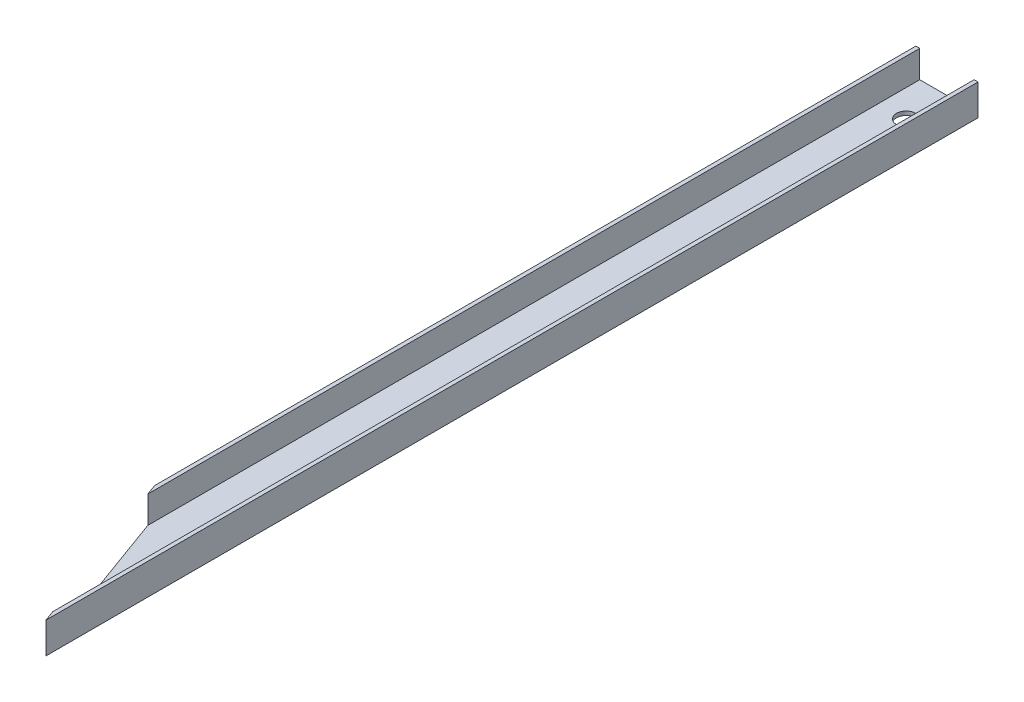
ISO-10303-21;
HEADER;
FILE_DESCRIPTION(('STEP AP214'),'2;1');
FILE_NAME('part.step','',(''),(''),'','','');
FILE_SCHEMA(('AUTOMOTIVE_DESIGN { 1 0 10303 214 1 1 1 1 }'));
ENDSEC;
DATA;
#1=APPLICATION_CONTEXT('core data for automotive mechanical design processes');
#2=APPLICATION_PROTOCOL_DEFINITION('international standard','automotive_design',2000,#1);
#3=PRODUCT_CONTEXT('',#1,'mechanical');
#4=PRODUCT('Part','Part','',(#3));
#5=PRODUCT_RELATED_PRODUCT_CATEGORY('part','',(#4));
#6=PRODUCT_DEFINITION_FORMATION('','',#4);
#7=PRODUCT_DEFINITION_CONTEXT('part definition',#1,'design');
#8=PRODUCT_DEFINITION('design','',#6,#7);
#9=PRODUCT_DEFINITION_SHAPE('','',#8);
#10=(LENGTH_UNIT() NAMED_UNIT(*) SI_UNIT(.MILLI.,.METRE.));
#11=(NAMED_UNIT(*) PLANE_ANGLE_UNIT() SI_UNIT($,.RADIAN.));
#12=(NAMED_UNIT(*) SI_UNIT($,.STERADIAN.) SOLID_ANGLE_UNIT());
#13=UNCERTAINTY_MEASURE_WITH_UNIT(LENGTH_MEASURE(1.E-05),#10,'distance_accuracy_value','');
#14=(GEOMETRIC_REPRESENTATION_CONTEXT(3) GLOBAL_UNCERTAINTY_ASSIGNED_CONTEXT((#13)) GLOBAL_UNIT_ASSIGNED_CONTEXT((#10,
#11,#12)) REPRESENTATION_CONTEXT('',''));
#15=CARTESIAN_POINT('',(0.,0.,0.));
#16=DIRECTION('',(0.,0.,1.));
#17=DIRECTION('',(1.,0.,0.));
#18=AXIS2_PLACEMENT_3D('',#15,#16,#17);
#19=CARTESIAN_POINT('',(-22.225,-9.525,762.));
#20=DIRECTION('',(0.,-1.,0.));
#21=DIRECTION('',(0.,0.,-1.));
#22=AXIS2_PLACEMENT_3D('',#19,#20,#21);
#23=PLANE('',#22);
#24=CARTESIAN_POINT('',(0.,-9.525,33.3375));
#25=DIRECTION('',(0.,-1.,0.));
#26=DIRECTION('',(0.,0.,-1.));
#27=AXIS2_PLACEMENT_3D('',#24,#25,#26);
#28=CIRCLE('',#27,7.9375);
#29=CARTESIAN_POINT('',(0.,-9.525,25.4));
#30=VERTEX_POINT('',#29);
#31=EDGE_CURVE('E190',#30,#30,#28,.F.);
#32=ORIENTED_EDGE('',*,*,#31,.F.);
#33=EDGE_LOOP('',(#32));
#34=FACE_BOUND('',#33,.T.);
#35=DIRECTION('',(0.,0.,-1.));
#36=VECTOR('',#35,1.);
#37=CARTESIAN_POINT('',(-22.225,-9.525,762.));
#38=LINE('',#37,#36);
#39=CARTESIAN_POINT('',(-22.225,-9.525,631.151387898475));
#40=VERTEX_POINT('',#39);
#41=CARTESIAN_POINT('',(-22.225,-9.525,0.));
#42=VERTEX_POINT('',#41);
#43=EDGE_CURVE('E11',#40,#42,#38,.T.);
#44=ORIENTED_EDGE('',*,*,#43,.F.);
#45=DIRECTION('',(0.342020143325673,0.,0.939692620785907));
#46=VECTOR('',#45,1.);
#47=CARTESIAN_POINT('',(19.8289333017705,-9.525,746.693620044339));
#48=LINE('',#47,#46);
#49=CARTESIAN_POINT('',(22.225,-9.525,753.276759193232));
#50=VERTEX_POINT('',#49);
#51=EDGE_CURVE('E179',#40,#50,#48,.T.);
#52=ORIENTED_EDGE('',*,*,#51,.T.);
#53=DIRECTION('',(0.,0.,-1.));
#54=VECTOR('',#53,1.);
#55=CARTESIAN_POINT('',(22.225,-9.525,762.));
#56=LINE('',#55,#54);
#57=CARTESIAN_POINT('',(22.225,-9.525,0.));
#58=VERTEX_POINT('',#57);
#59=EDGE_CURVE('E95',#50,#58,#56,.T.);
#60=ORIENTED_EDGE('',*,*,#59,.T.);
#61=DIRECTION('',(-1.,0.,0.));
#62=VECTOR('',#61,1.);
#63=CARTESIAN_POINT('',(-22.225,-9.525,0.));
#64=LINE('',#63,#62);
#65=EDGE_CURVE('E109',#58,#42,#64,.T.);
#66=ORIENTED_EDGE('',*,*,#65,.T.);
#67=EDGE_LOOP('',(#44,#52,#60,#66));
#68=FACE_BOUND('',#67,.T.);
#69=ADVANCED_FACE('F36',(#34,#68),#23,.F.);
#70=CARTESIAN_POINT('',(-22.225,-9.525,762.));
#71=DIRECTION('',(-1.,0.,0.));
#72=DIRECTION('',(0.,0.,1.));
#73=AXIS2_PLACEMENT_3D('',#70,#71,#72);
#74=PLANE('',#73);
#75=DIRECTION('',(0.,0.,-1.));
#76=VECTOR('',#75,1.);
#77=CARTESIAN_POINT('',(-22.225,12.7,762.));
#78=LINE('',#77,#76);
#79=CARTESIAN_POINT('',(-22.225,12.7,631.151387898475));
#80=VERTEX_POINT('',#79);
#81=CARTESIAN_POINT('',(-22.225,12.7,0.));
#82=VERTEX_POINT('',#81);
#83=EDGE_CURVE('E45',#80,#82,#78,.T.);
#84=ORIENTED_EDGE('',*,*,#83,.F.);
#85=DIRECTION('',(0.,-1.,0.));
#86=VECTOR('',#85,1.);
#87=CARTESIAN_POINT('',(-22.225,-9.52500000000002,631.151387898475));
#88=LINE('',#87,#86);
#89=EDGE_CURVE('E181',#80,#40,#88,.T.);
#90=ORIENTED_EDGE('',*,*,#89,.T.);
#91=ORIENTED_EDGE('',*,*,#43,.T.);
#92=DIRECTION('',(0.,1.,0.));
#93=VECTOR('',#92,1.);
#94=CARTESIAN_POINT('',(-22.225,-9.525,0.));
#95=LINE('',#94,#93);
#96=EDGE_CURVE('E144',#42,#82,#95,.T.);
#97=ORIENTED_EDGE('',*,*,#96,.T.);
#98=EDGE_LOOP('',(#84,#90,#91,#97));
#99=FACE_BOUND('',#98,.T.);
#100=ADVANCED_FACE('F145',(#99),#74,.F.);
#101=CARTESIAN_POINT('',(-25.4,12.7,762.));
#102=DIRECTION('',(0.,-1.,0.));
#103=DIRECTION('',(0.,0.,-1.));
#104=AXIS2_PLACEMENT_3D('',#101,#102,#103);
#105=PLANE('',#104);
#106=DIRECTION('',(0.,0.,-1.));
#107=VECTOR('',#106,1.);
#108=CARTESIAN_POINT('',(-25.4,12.7,762.));
#109=LINE('',#108,#107);
#110=CARTESIAN_POINT('',(-25.4,12.7,622.428147091707));
#111=VERTEX_POINT('',#110);
#112=CARTESIAN_POINT('',(-25.4,12.7,0.));
#113=VERTEX_POINT('',#112);
#114=EDGE_CURVE('E126',#111,#113,#109,.T.);
#115=ORIENTED_EDGE('',*,*,#114,.F.);
#116=DIRECTION('',(0.342020143325673,0.,0.939692620785907));
#117=VECTOR('',#116,1.);
#118=CARTESIAN_POINT('',(25.4,12.7,762.));
#119=LINE('',#118,#117);
#120=EDGE_CURVE('E141',#111,#80,#119,.T.);
#121=ORIENTED_EDGE('',*,*,#120,.T.);
#122=ORIENTED_EDGE('',*,*,#83,.T.);
#123=DIRECTION('',(-1.,0.,0.));
#124=VECTOR('',#123,1.);
#125=CARTESIAN_POINT('',(-25.4,12.7,0.));
#126=LINE('',#125,#124);
#127=EDGE_CURVE('E137',#82,#113,#126,.T.);
#128=ORIENTED_EDGE('',*,*,#127,.T.);
#129=EDGE_LOOP('',(#115,#121,#122,#128));
#130=FACE_BOUND('',#129,.T.);
#131=ADVANCED_FACE('F135',(#130),#105,.F.);
#132=CARTESIAN_POINT('',(-25.4,-12.7,762.));
#133=DIRECTION('',(1.,0.,0.));
#134=DIRECTION('',(0.,1.,0.));
#135=AXIS2_PLACEMENT_3D('',#132,#133,#134);
#136=PLANE('',#135);
#137=DIRECTION('',(0.,0.,-1.));
#138=VECTOR('',#137,1.);
#139=CARTESIAN_POINT('',(-25.4,-12.7,762.));
#140=LINE('',#139,#138);
#141=CARTESIAN_POINT('',(-25.4,-12.7,622.428147091707));
#142=VERTEX_POINT('',#141);
#143=CARTESIAN_POINT('',(-25.4,-12.7,0.));
#144=VERTEX_POINT('',#143);
#145=EDGE_CURVE('E123',#142,#144,#140,.T.);
#146=ORIENTED_EDGE('',*,*,#145,.F.);
#147=DIRECTION('',(0.,-1.,0.));
#148=VECTOR('',#147,1.);
#149=CARTESIAN_POINT('',(-25.4,12.7,622.428147091707));
#150=LINE('',#149,#148);
#151=EDGE_CURVE('E168',#111,#142,#150,.T.);
#152=ORIENTED_EDGE('',*,*,#151,.F.);
#153=ORIENTED_EDGE('',*,*,#114,.T.);
#154=DIRECTION('',(0.,-1.,0.));
#155=VECTOR('',#154,1.);
#156=CARTESIAN_POINT('',(-25.4,-12.7,0.));
#157=LINE('',#156,#155);
#158=EDGE_CURVE('E150',#113,#144,#157,.T.);
#159=ORIENTED_EDGE('',*,*,#158,.T.);
#160=EDGE_LOOP('',(#146,#152,#153,#159));
#161=FACE_BOUND('',#160,.T.);
#162=ADVANCED_FACE('F166',(#161),#136,.F.);
#163=CARTESIAN_POINT('',(-25.4,-12.7,762.));
#164=DIRECTION('',(0.,1.,0.));
#165=DIRECTION('',(-1.,0.,0.));
#166=AXIS2_PLACEMENT_3D('',#163,#164,#165);
#167=PLANE('',#166);
#168=CARTESIAN_POINT('',(0.,-12.7,33.3375));
#169=DIRECTION('',(0.,-1.,0.));
#170=DIRECTION('',(1.,0.,0.));
#171=AXIS2_PLACEMENT_3D('',#168,#169,#170);
#172=CIRCLE('',#171,7.9375);
#173=CARTESIAN_POINT('',(7.9375,-12.7,33.3375));
#174=VERTEX_POINT('',#173);
#175=EDGE_CURVE('E194',#174,#174,#172,.T.);
#176=ORIENTED_EDGE('',*,*,#175,.F.);
#177=EDGE_LOOP('',(#176));
#178=FACE_BOUND('',#177,.T.);
#179=DIRECTION('',(0.,0.,-1.));
#180=VECTOR('',#179,1.);
#181=CARTESIAN_POINT('',(25.4,-12.7,762.));
#182=LINE('',#181,#180);
#183=CARTESIAN_POINT('',(25.4,-12.7,762.));
#184=VERTEX_POINT('',#183);
#185=CARTESIAN_POINT('',(25.4,-12.7,0.));
#186=VERTEX_POINT('',#185);
#187=EDGE_CURVE('E119',#184,#186,#182,.T.);
#188=ORIENTED_EDGE('',*,*,#187,.F.);
#189=DIRECTION('',(0.342020143325673,0.,0.939692620785907));
#190=VECTOR('',#189,1.);
#191=CARTESIAN_POINT('',(25.4,-12.7,762.));
#192=LINE('',#191,#190);
#193=EDGE_CURVE('E52',#142,#184,#192,.T.);
#194=ORIENTED_EDGE('',*,*,#193,.F.);
#195=ORIENTED_EDGE('',*,*,#145,.T.);
#196=DIRECTION('',(1.,0.,0.));
#197=VECTOR('',#196,1.);
#198=CARTESIAN_POINT('',(-25.4,-12.7,0.));
#199=LINE('',#198,#197);
#200=EDGE_CURVE('E152',#144,#186,#199,.T.);
#201=ORIENTED_EDGE('',*,*,#200,.T.);
#202=EDGE_LOOP('',(#188,#194,#195,#201));
#203=FACE_BOUND('',#202,.T.);
#204=ADVANCED_FACE('F161',(#178,#203),#167,.F.);
#205=CARTESIAN_POINT('',(25.4,-12.7,762.));
#206=DIRECTION('',(-1.,0.,0.));
#207=DIRECTION('',(0.,0.,1.));
#208=AXIS2_PLACEMENT_3D('',#205,#206,#207);
#209=PLANE('',#208);
#210=DIRECTION('',(0.,1.,0.));
#211=VECTOR('',#210,1.);
#212=CARTESIAN_POINT('',(25.4,-12.7,0.));
#213=LINE('',#212,#211);
#214=CARTESIAN_POINT('',(25.4,12.7,0.));
#215=VERTEX_POINT('',#214);
#216=EDGE_CURVE('E104',#186,#215,#213,.T.);
#217=ORIENTED_EDGE('',*,*,#216,.T.);
#218=DIRECTION('',(0.,0.,-1.));
#219=VECTOR('',#218,1.);
#220=CARTESIAN_POINT('',(25.4,12.7,762.));
#221=LINE('',#220,#219);
#222=CARTESIAN_POINT('',(25.4,12.7,762.));
#223=VERTEX_POINT('',#222);
#224=EDGE_CURVE('E94',#223,#215,#221,.T.);
#225=ORIENTED_EDGE('',*,*,#224,.F.);
#226=DIRECTION('',(0.,1.,0.));
#227=VECTOR('',#226,1.);
#228=CARTESIAN_POINT('',(25.4,-12.7,762.));
#229=LINE('',#228,#227);
#230=EDGE_CURVE('E110',#184,#223,#229,.T.);
#231=ORIENTED_EDGE('',*,*,#230,.F.);
#232=ORIENTED_EDGE('',*,*,#187,.T.);
#233=EDGE_LOOP('',(#217,#225,#231,#232));
#234=FACE_BOUND('',#233,.T.);
#235=ADVANCED_FACE('F157',(#234),#209,.F.);
#236=CARTESIAN_POINT('',(25.4,12.7,762.));
#237=DIRECTION('',(0.,-1.,0.));
#238=DIRECTION('',(0.,0.,-1.));
#239=AXIS2_PLACEMENT_3D('',#236,#237,#238);
#240=PLANE('',#239);
#241=DIRECTION('',(0.,0.,-1.));
#242=VECTOR('',#241,1.);
#243=CARTESIAN_POINT('',(22.225,12.7,762.));
#244=LINE('',#243,#242);
#245=CARTESIAN_POINT('',(22.225,12.7,753.276759193232));
#246=VERTEX_POINT('',#245);
#247=CARTESIAN_POINT('',(22.225,12.7,0.));
#248=VERTEX_POINT('',#247);
#249=EDGE_CURVE('E81',#246,#248,#244,.T.);
#250=ORIENTED_EDGE('',*,*,#249,.F.);
#251=EDGE_CURVE('E189',#246,#223,#119,.T.);
#252=ORIENTED_EDGE('',*,*,#251,.T.);
#253=ORIENTED_EDGE('',*,*,#224,.T.);
#254=DIRECTION('',(-1.,0.,0.));
#255=VECTOR('',#254,1.);
#256=CARTESIAN_POINT('',(25.4,12.7,0.));
#257=LINE('',#256,#255);
#258=EDGE_CURVE('E99',#215,#248,#257,.T.);
#259=ORIENTED_EDGE('',*,*,#258,.T.);
#260=EDGE_LOOP('',(#250,#252,#253,#259));
#261=FACE_BOUND('',#260,.T.);
#262=ADVANCED_FACE('F100',(#261),#240,.F.);
#263=CARTESIAN_POINT('',(22.225,-9.525,762.));
#264=DIRECTION('',(1.,0.,0.));
#265=DIRECTION('',(0.,0.,-1.));
#266=AXIS2_PLACEMENT_3D('',#263,#264,#265);
#267=PLANE('',#266);
#268=ORIENTED_EDGE('',*,*,#59,.F.);
#269=DIRECTION('',(0.,1.,0.));
#270=VECTOR('',#269,1.);
#271=CARTESIAN_POINT('',(22.225,-9.525,753.276759193232));
#272=LINE('',#271,#270);
#273=EDGE_CURVE('E90',#50,#246,#272,.T.);
#274=ORIENTED_EDGE('',*,*,#273,.T.);
#275=ORIENTED_EDGE('',*,*,#249,.T.);
#276=DIRECTION('',(0.,-1.,0.));
#277=VECTOR('',#276,1.);
#278=CARTESIAN_POINT('',(22.225,-9.525,0.));
#279=LINE('',#278,#277);
#280=EDGE_CURVE('E86',#248,#58,#279,.T.);
#281=ORIENTED_EDGE('',*,*,#280,.T.);
#282=EDGE_LOOP('',(#268,#274,#275,#281));
#283=FACE_BOUND('',#282,.T.);
#284=ADVANCED_FACE('F84',(#283),#267,.F.);
#285=CARTESIAN_POINT('',(0.,0.,0.));
#286=DIRECTION('',(0.,0.,1.));
#287=DIRECTION('',(1.,0.,0.));
#288=AXIS2_PLACEMENT_3D('',#285,#286,#287);
#289=PLANE('',#288);
#290=ORIENTED_EDGE('',*,*,#65,.F.);
#291=ORIENTED_EDGE('',*,*,#280,.F.);
#292=ORIENTED_EDGE('',*,*,#258,.F.);
#293=ORIENTED_EDGE('',*,*,#216,.F.);
#294=ORIENTED_EDGE('',*,*,#200,.F.);
#295=ORIENTED_EDGE('',*,*,#158,.F.);
#296=ORIENTED_EDGE('',*,*,#127,.F.);
#297=ORIENTED_EDGE('',*,*,#96,.F.);
#298=EDGE_LOOP('',(#290,#291,#292,#293,#294,#295,#296,#297));
#299=FACE_BOUND('',#298,.T.);
#300=ADVANCED_FACE('F106',(#299),#289,.F.);
#301=CARTESIAN_POINT('',(25.4,12.7,762.));
#302=DIRECTION('',(0.939692620785907,0.,-0.342020143325673));
#303=DIRECTION('',(-0.342020143325673,0.,-0.939692620785907));
#304=AXIS2_PLACEMENT_3D('',#301,#302,#303);
#305=PLANE('',#304);
#306=ORIENTED_EDGE('',*,*,#120,.F.);
#307=ORIENTED_EDGE('',*,*,#151,.T.);
#308=ORIENTED_EDGE('',*,*,#193,.T.);
#309=ORIENTED_EDGE('',*,*,#230,.T.);
#310=ORIENTED_EDGE('',*,*,#251,.F.);
#311=ORIENTED_EDGE('',*,*,#273,.F.);
#312=ORIENTED_EDGE('',*,*,#51,.F.);
#313=ORIENTED_EDGE('',*,*,#89,.F.);
#314=EDGE_LOOP('',(#306,#307,#308,#309,#310,#311,#312,#313));
#315=FACE_BOUND('',#314,.T.);
#316=ADVANCED_FACE('F180',(#315),#305,.F.);
#317=CARTESIAN_POINT('',(0.,12.701,33.3375));
#318=DIRECTION('',(0.,-1.,0.));
#319=DIRECTION('',(1.,0.,0.));
#320=AXIS2_PLACEMENT_3D('',#317,#318,#319);
#321=CYLINDRICAL_SURFACE('',#320,7.9375);
#322=ORIENTED_EDGE('',*,*,#175,.T.);
#323=EDGE_LOOP('',(#322));
#324=FACE_BOUND('',#323,.T.);
#325=ORIENTED_EDGE('',*,*,#31,.T.);
#326=EDGE_LOOP('',(#325));
#327=FACE_BOUND('',#326,.T.);
#328=ADVANCED_FACE('F198',(#324,#327),#321,.F.);
#329=CLOSED_SHELL('',(#69,#100,#131,#162,#204,#235,#262,#284,#300,#316,#328));
#330=MANIFOLD_SOLID_BREP('B2',#329);
#331=ADVANCED_BREP_SHAPE_REPRESENTATION('',(#18,#330),#14);
#332=SHAPE_DEFINITION_REPRESENTATION(#9,#331);
ENDSEC;
END-ISO-10303-21;
